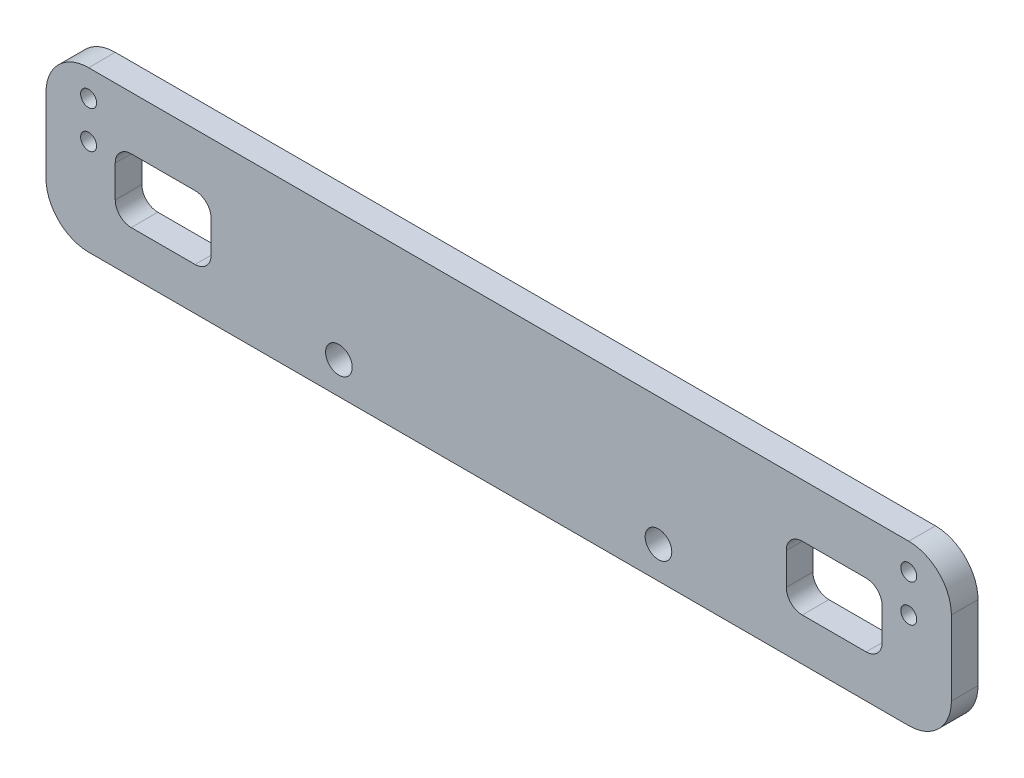
ISO-10303-21;
HEADER;
FILE_DESCRIPTION(('STEP AP214'),'2;1');
FILE_NAME('part.step','',(''),(''),'','','');
FILE_SCHEMA(('AUTOMOTIVE_DESIGN { 1 0 10303 214 1 1 1 1 }'));
ENDSEC;
DATA;
#1=APPLICATION_CONTEXT('core data for automotive mechanical design processes');
#2=APPLICATION_PROTOCOL_DEFINITION('international standard','automotive_design',2000,#1);
#3=PRODUCT_CONTEXT('',#1,'mechanical');
#4=PRODUCT('Part','Part','',(#3));
#5=PRODUCT_RELATED_PRODUCT_CATEGORY('part','',(#4));
#6=PRODUCT_DEFINITION_FORMATION('','',#4);
#7=PRODUCT_DEFINITION_CONTEXT('part definition',#1,'design');
#8=PRODUCT_DEFINITION('design','',#6,#7);
#9=PRODUCT_DEFINITION_SHAPE('','',#8);
#10=(LENGTH_UNIT() NAMED_UNIT(*) SI_UNIT(.MILLI.,.METRE.));
#11=(NAMED_UNIT(*) PLANE_ANGLE_UNIT() SI_UNIT($,.RADIAN.));
#12=(NAMED_UNIT(*) SI_UNIT($,.STERADIAN.) SOLID_ANGLE_UNIT());
#13=UNCERTAINTY_MEASURE_WITH_UNIT(LENGTH_MEASURE(1.E-05),#10,'distance_accuracy_value','');
#14=(GEOMETRIC_REPRESENTATION_CONTEXT(3) GLOBAL_UNCERTAINTY_ASSIGNED_CONTEXT((#13)) GLOBAL_UNIT_ASSIGNED_CONTEXT((#10,
#11,#12)) REPRESENTATION_CONTEXT('',''));
#15=CARTESIAN_POINT('',(0.,0.,0.));
#16=DIRECTION('',(0.,0.,1.));
#17=DIRECTION('',(1.,0.,0.));
#18=AXIS2_PLACEMENT_3D('',#15,#16,#17);
#19=CARTESIAN_POINT('',(0.,0.,5.));
#20=DIRECTION('',(0.,0.,-1.));
#21=DIRECTION('',(-1.,0.,0.));
#22=AXIS2_PLACEMENT_3D('',#19,#20,#21);
#23=PLANE('',#22);
#24=DIRECTION('',(-1.,0.,0.));
#25=VECTOR('',#24,1.);
#26=CARTESIAN_POINT('',(0.,-6.,5.));
#27=LINE('',#26,#25);
#28=CARTESIAN_POINT('',(69.,-6.,5.));
#29=VERTEX_POINT('',#28);
#30=CARTESIAN_POINT('',(57.,-6.,5.));
#31=VERTEX_POINT('',#30);
#32=EDGE_CURVE('E431',#29,#31,#27,.T.);
#33=ORIENTED_EDGE('',*,*,#32,.F.);
#34=CARTESIAN_POINT('',(69.,-9.,5.));
#35=DIRECTION('',(0.,0.,-1.));
#36=DIRECTION('',(-1.,0.,0.));
#37=AXIS2_PLACEMENT_3D('',#34,#35,#36);
#38=CIRCLE('',#37,3.);
#39=CARTESIAN_POINT('',(72.,-9.,5.));
#40=VERTEX_POINT('',#39);
#41=EDGE_CURVE('E227',#29,#40,#38,.T.);
#42=ORIENTED_EDGE('',*,*,#41,.T.);
#43=DIRECTION('',(0.,1.,0.));
#44=VECTOR('',#43,1.);
#45=CARTESIAN_POINT('',(72.,0.,5.));
#46=LINE('',#45,#44);
#47=CARTESIAN_POINT('',(72.,-15.,5.));
#48=VERTEX_POINT('',#47);
#49=EDGE_CURVE('E206',#48,#40,#46,.T.);
#50=ORIENTED_EDGE('',*,*,#49,.F.);
#51=CARTESIAN_POINT('',(69.,-15.,5.));
#52=DIRECTION('',(0.,0.,-1.));
#53=DIRECTION('',(-1.,0.,0.));
#54=AXIS2_PLACEMENT_3D('',#51,#52,#53);
#55=CIRCLE('',#54,3.);
#56=CARTESIAN_POINT('',(69.,-18.,5.));
#57=VERTEX_POINT('',#56);
#58=EDGE_CURVE('E373',#48,#57,#55,.T.);
#59=ORIENTED_EDGE('',*,*,#58,.T.);
#60=DIRECTION('',(1.,0.,0.));
#61=VECTOR('',#60,1.);
#62=CARTESIAN_POINT('',(0.,-18.,5.));
#63=LINE('',#62,#61);
#64=CARTESIAN_POINT('',(57.,-18.,5.));
#65=VERTEX_POINT('',#64);
#66=EDGE_CURVE('E379',#65,#57,#63,.T.);
#67=ORIENTED_EDGE('',*,*,#66,.F.);
#68=CARTESIAN_POINT('',(57.,-15.,5.));
#69=DIRECTION('',(0.,0.,-1.));
#70=DIRECTION('',(-1.,0.,0.));
#71=AXIS2_PLACEMENT_3D('',#68,#69,#70);
#72=CIRCLE('',#71,3.);
#73=CARTESIAN_POINT('',(54.,-15.,5.));
#74=VERTEX_POINT('',#73);
#75=EDGE_CURVE('E226',#65,#74,#72,.T.);
#76=ORIENTED_EDGE('',*,*,#75,.T.);
#77=DIRECTION('',(0.,-1.,0.));
#78=VECTOR('',#77,1.);
#79=CARTESIAN_POINT('',(54.,0.,5.));
#80=LINE('',#79,#78);
#81=CARTESIAN_POINT('',(54.,-9.,5.));
#82=VERTEX_POINT('',#81);
#83=EDGE_CURVE('E386',#82,#74,#80,.T.);
#84=ORIENTED_EDGE('',*,*,#83,.F.);
#85=CARTESIAN_POINT('',(57.,-9.,5.));
#86=DIRECTION('',(0.,0.,-1.));
#87=DIRECTION('',(-1.,0.,0.));
#88=AXIS2_PLACEMENT_3D('',#85,#86,#87);
#89=CIRCLE('',#88,3.);
#90=EDGE_CURVE('E235',#82,#31,#89,.T.);
#91=ORIENTED_EDGE('',*,*,#90,.T.);
#92=EDGE_LOOP('',(#33,#42,#50,#59,#67,#76,#84,#91));
#93=FACE_BOUND('',#92,.T.);
#94=CARTESIAN_POINT('',(77.0000000000001,-8.,5.));
#95=DIRECTION('',(0.,0.,1.));
#96=DIRECTION('',(-1.,0.,0.));
#97=AXIS2_PLACEMENT_3D('',#94,#95,#96);
#98=CIRCLE('',#97,1.5);
#99=CARTESIAN_POINT('',(75.5000000000001,-8.,5.));
#100=VERTEX_POINT('',#99);
#101=EDGE_CURVE('E463',#100,#100,#98,.T.);
#102=ORIENTED_EDGE('',*,*,#101,.F.);
#103=EDGE_LOOP('',(#102));
#104=FACE_BOUND('',#103,.T.);
#105=CARTESIAN_POINT('',(77.0000000000001,-1.,5.));
#106=DIRECTION('',(0.,0.,1.));
#107=DIRECTION('',(-1.,0.,0.));
#108=AXIS2_PLACEMENT_3D('',#105,#106,#107);
#109=CIRCLE('',#108,1.5);
#110=CARTESIAN_POINT('',(75.5000000000001,-1.,5.));
#111=VERTEX_POINT('',#110);
#112=EDGE_CURVE('E469',#111,#111,#109,.T.);
#113=ORIENTED_EDGE('',*,*,#112,.F.);
#114=EDGE_LOOP('',(#113));
#115=FACE_BOUND('',#114,.T.);
#116=CARTESIAN_POINT('',(-77.,-1.,5.));
#117=DIRECTION('',(0.,0.,1.));
#118=DIRECTION('',(1.,0.,0.));
#119=AXIS2_PLACEMENT_3D('',#116,#117,#118);
#120=CIRCLE('',#119,1.5);
#121=CARTESIAN_POINT('',(-75.5,-1.,5.));
#122=VERTEX_POINT('',#121);
#123=EDGE_CURVE('E475',#122,#122,#120,.T.);
#124=ORIENTED_EDGE('',*,*,#123,.F.);
#125=EDGE_LOOP('',(#124));
#126=FACE_BOUND('',#125,.T.);
#127=CARTESIAN_POINT('',(-77.,-8.,5.));
#128=DIRECTION('',(0.,0.,1.));
#129=DIRECTION('',(1.,0.,0.));
#130=AXIS2_PLACEMENT_3D('',#127,#128,#129);
#131=CIRCLE('',#130,1.5);
#132=CARTESIAN_POINT('',(-75.5,-8.,5.));
#133=VERTEX_POINT('',#132);
#134=EDGE_CURVE('E316',#133,#133,#131,.T.);
#135=ORIENTED_EDGE('',*,*,#134,.F.);
#136=EDGE_LOOP('',(#135));
#137=FACE_BOUND('',#136,.T.);
#138=DIRECTION('',(0.,-1.,0.));
#139=VECTOR('',#138,1.);
#140=CARTESIAN_POINT('',(-85.,-30.,5.));
#141=LINE('',#140,#139);
#142=CARTESIAN_POINT('',(-85.,-4.,5.));
#143=VERTEX_POINT('',#142);
#144=CARTESIAN_POINT('',(-85.,-18.,5.));
#145=VERTEX_POINT('',#144);
#146=EDGE_CURVE('E309',#143,#145,#141,.T.);
#147=ORIENTED_EDGE('',*,*,#146,.T.);
#148=CARTESIAN_POINT('',(-77.,-18.,5.));
#149=DIRECTION('',(0.,0.,-1.));
#150=DIRECTION('',(-1.,0.,0.));
#151=AXIS2_PLACEMENT_3D('',#148,#149,#150);
#152=CIRCLE('',#151,8.);
#153=CARTESIAN_POINT('',(-77.,-26.,5.));
#154=VERTEX_POINT('',#153);
#155=EDGE_CURVE('E267',#145,#154,#152,.F.);
#156=ORIENTED_EDGE('',*,*,#155,.T.);
#157=DIRECTION('',(-1.,0.,0.));
#158=VECTOR('',#157,1.);
#159=CARTESIAN_POINT('',(-85.,-26.,5.));
#160=LINE('',#159,#158);
#161=CARTESIAN_POINT('',(77.,-26.,5.));
#162=VERTEX_POINT('',#161);
#163=EDGE_CURVE('E429',#162,#154,#160,.T.);
#164=ORIENTED_EDGE('',*,*,#163,.F.);
#165=CARTESIAN_POINT('',(77.,-18.,5.));
#166=DIRECTION('',(0.,0.,-1.));
#167=DIRECTION('',(-1.,0.,0.));
#168=AXIS2_PLACEMENT_3D('',#165,#166,#167);
#169=CIRCLE('',#168,8.);
#170=CARTESIAN_POINT('',(85.,-18.,5.));
#171=VERTEX_POINT('',#170);
#172=EDGE_CURVE('E265',#162,#171,#169,.F.);
#173=ORIENTED_EDGE('',*,*,#172,.T.);
#174=DIRECTION('',(0.,1.,0.));
#175=VECTOR('',#174,1.);
#176=CARTESIAN_POINT('',(85.,-30.,5.));
#177=LINE('',#176,#175);
#178=CARTESIAN_POINT('',(85.,-3.99999999999998,5.));
#179=VERTEX_POINT('',#178);
#180=EDGE_CURVE('E312',#171,#179,#177,.T.);
#181=ORIENTED_EDGE('',*,*,#180,.T.);
#182=CARTESIAN_POINT('',(77.,-3.99999999999998,5.));
#183=DIRECTION('',(0.,0.,-1.));
#184=DIRECTION('',(-1.,0.,0.));
#185=AXIS2_PLACEMENT_3D('',#182,#183,#184);
#186=CIRCLE('',#185,8.);
#187=CARTESIAN_POINT('',(77.,4.00000000000002,5.));
#188=VERTEX_POINT('',#187);
#189=EDGE_CURVE('E263',#179,#188,#186,.F.);
#190=ORIENTED_EDGE('',*,*,#189,.T.);
#191=DIRECTION('',(1.,0.,0.));
#192=VECTOR('',#191,1.);
#193=CARTESIAN_POINT('',(85.,4.00000000000002,5.));
#194=LINE('',#193,#192);
#195=CARTESIAN_POINT('',(-77.,4.,5.));
#196=VERTEX_POINT('',#195);
#197=EDGE_CURVE('E290',#196,#188,#194,.T.);
#198=ORIENTED_EDGE('',*,*,#197,.F.);
#199=CARTESIAN_POINT('',(-77.,-4.,5.));
#200=DIRECTION('',(0.,0.,-1.));
#201=DIRECTION('',(-1.,0.,0.));
#202=AXIS2_PLACEMENT_3D('',#199,#200,#201);
#203=CIRCLE('',#202,8.);
#204=EDGE_CURVE('E261',#196,#143,#203,.F.);
#205=ORIENTED_EDGE('',*,*,#204,.T.);
#206=EDGE_LOOP('',(#147,#156,#164,#173,#181,#190,#198,#205));
#207=FACE_BOUND('',#206,.T.);
#208=CARTESIAN_POINT('',(-30.,-20.,5.));
#209=DIRECTION('',(0.,0.,1.));
#210=DIRECTION('',(1.,0.,0.));
#211=AXIS2_PLACEMENT_3D('',#208,#209,#210);
#212=CIRCLE('',#211,2.5);
#213=CARTESIAN_POINT('',(-27.5,-20.,5.));
#214=VERTEX_POINT('',#213);
#215=EDGE_CURVE('E454',#214,#214,#212,.T.);
#216=ORIENTED_EDGE('',*,*,#215,.F.);
#217=EDGE_LOOP('',(#216));
#218=FACE_BOUND('',#217,.T.);
#219=CARTESIAN_POINT('',(30.,-20.,5.));
#220=DIRECTION('',(0.,0.,1.));
#221=DIRECTION('',(1.,0.,0.));
#222=AXIS2_PLACEMENT_3D('',#219,#220,#221);
#223=CIRCLE('',#222,2.5);
#224=CARTESIAN_POINT('',(32.5,-20.,5.));
#225=VERTEX_POINT('',#224);
#226=EDGE_CURVE('E450',#225,#225,#223,.T.);
#227=ORIENTED_EDGE('',*,*,#226,.F.);
#228=EDGE_LOOP('',(#227));
#229=FACE_BOUND('',#228,.T.);
#230=DIRECTION('',(-1.,0.,0.));
#231=VECTOR('',#230,1.);
#232=CARTESIAN_POINT('',(0.,-18.,5.));
#233=LINE('',#232,#231);
#234=CARTESIAN_POINT('',(-57.,-18.,5.));
#235=VERTEX_POINT('',#234);
#236=CARTESIAN_POINT('',(-69.,-18.,5.));
#237=VERTEX_POINT('',#236);
#238=EDGE_CURVE('E441',#235,#237,#233,.T.);
#239=ORIENTED_EDGE('',*,*,#238,.T.);
#240=CARTESIAN_POINT('',(-69.,-15.,5.));
#241=DIRECTION('',(0.,0.,-1.));
#242=DIRECTION('',(-1.,0.,0.));
#243=AXIS2_PLACEMENT_3D('',#240,#241,#242);
#244=CIRCLE('',#243,3.);
#245=CARTESIAN_POINT('',(-72.,-15.,5.));
#246=VERTEX_POINT('',#245);
#247=EDGE_CURVE('E247',#237,#246,#244,.T.);
#248=ORIENTED_EDGE('',*,*,#247,.T.);
#249=DIRECTION('',(0.,1.,0.));
#250=VECTOR('',#249,1.);
#251=CARTESIAN_POINT('',(-72.,0.,5.));
#252=LINE('',#251,#250);
#253=CARTESIAN_POINT('',(-72.,-9.,5.));
#254=VERTEX_POINT('',#253);
#255=EDGE_CURVE('E385',#246,#254,#252,.T.);
#256=ORIENTED_EDGE('',*,*,#255,.T.);
#257=CARTESIAN_POINT('',(-69.,-9.,5.));
#258=DIRECTION('',(0.,0.,-1.));
#259=DIRECTION('',(-1.,0.,0.));
#260=AXIS2_PLACEMENT_3D('',#257,#258,#259);
#261=CIRCLE('',#260,3.);
#262=CARTESIAN_POINT('',(-69.,-6.,5.));
#263=VERTEX_POINT('',#262);
#264=EDGE_CURVE('E251',#254,#263,#261,.T.);
#265=ORIENTED_EDGE('',*,*,#264,.T.);
#266=DIRECTION('',(1.,0.,0.));
#267=VECTOR('',#266,1.);
#268=CARTESIAN_POINT('',(0.,-6.,5.));
#269=LINE('',#268,#267);
#270=CARTESIAN_POINT('',(-57.,-6.,5.));
#271=VERTEX_POINT('',#270);
#272=EDGE_CURVE('E300',#263,#271,#269,.T.);
#273=ORIENTED_EDGE('',*,*,#272,.T.);
#274=CARTESIAN_POINT('',(-57.,-9.,5.));
#275=DIRECTION('',(0.,0.,-1.));
#276=DIRECTION('',(-1.,0.,0.));
#277=AXIS2_PLACEMENT_3D('',#274,#275,#276);
#278=CIRCLE('',#277,3.);
#279=CARTESIAN_POINT('',(-54.,-9.,5.));
#280=VERTEX_POINT('',#279);
#281=EDGE_CURVE('E243',#271,#280,#278,.T.);
#282=ORIENTED_EDGE('',*,*,#281,.T.);
#283=DIRECTION('',(0.,-1.,0.));
#284=VECTOR('',#283,1.);
#285=CARTESIAN_POINT('',(-54.,0.,5.));
#286=LINE('',#285,#284);
#287=CARTESIAN_POINT('',(-54.,-15.,5.));
#288=VERTEX_POINT('',#287);
#289=EDGE_CURVE('E444',#280,#288,#286,.T.);
#290=ORIENTED_EDGE('',*,*,#289,.T.);
#291=CARTESIAN_POINT('',(-57.,-15.,5.));
#292=DIRECTION('',(0.,0.,-1.));
#293=DIRECTION('',(-1.,0.,0.));
#294=AXIS2_PLACEMENT_3D('',#291,#292,#293);
#295=CIRCLE('',#294,3.);
#296=EDGE_CURVE('E239',#288,#235,#295,.T.);
#297=ORIENTED_EDGE('',*,*,#296,.T.);
#298=EDGE_LOOP('',(#239,#248,#256,#265,#273,#282,#290,#297));
#299=FACE_BOUND('',#298,.T.);
#300=ADVANCED_FACE('F36',(#93,#104,#115,#126,#137,#207,#218,#229,#299),#23,.F.);
#301=CARTESIAN_POINT('',(0.,0.,0.));
#302=DIRECTION('',(0.,0.,-1.));
#303=DIRECTION('',(-1.,0.,0.));
#304=AXIS2_PLACEMENT_3D('',#301,#302,#303);
#305=PLANE('',#304);
#306=DIRECTION('',(-1.,0.,0.));
#307=VECTOR('',#306,1.);
#308=CARTESIAN_POINT('',(-85.,-26.,0.));
#309=LINE('',#308,#307);
#310=CARTESIAN_POINT('',(77.,-26.,0.));
#311=VERTEX_POINT('',#310);
#312=CARTESIAN_POINT('',(-77.,-26.,0.));
#313=VERTEX_POINT('',#312);
#314=EDGE_CURVE('E423',#311,#313,#309,.T.);
#315=ORIENTED_EDGE('',*,*,#314,.T.);
#316=CARTESIAN_POINT('',(-77.,-18.,0.));
#317=DIRECTION('',(0.,0.,-1.));
#318=DIRECTION('',(-1.,0.,0.));
#319=AXIS2_PLACEMENT_3D('',#316,#317,#318);
#320=CIRCLE('',#319,8.);
#321=CARTESIAN_POINT('',(-85.,-18.,0.));
#322=VERTEX_POINT('',#321);
#323=EDGE_CURVE('E279',#313,#322,#320,.T.);
#324=ORIENTED_EDGE('',*,*,#323,.T.);
#325=DIRECTION('',(0.,-1.,0.));
#326=VECTOR('',#325,1.);
#327=CARTESIAN_POINT('',(-85.,-30.,0.));
#328=LINE('',#327,#326);
#329=CARTESIAN_POINT('',(-85.,-4.,0.));
#330=VERTEX_POINT('',#329);
#331=EDGE_CURVE('E307',#330,#322,#328,.T.);
#332=ORIENTED_EDGE('',*,*,#331,.F.);
#333=CARTESIAN_POINT('',(-77.,-4.,0.));
#334=DIRECTION('',(0.,0.,-1.));
#335=DIRECTION('',(-1.,0.,0.));
#336=AXIS2_PLACEMENT_3D('',#333,#334,#335);
#337=CIRCLE('',#336,8.);
#338=CARTESIAN_POINT('',(-77.,4.,0.));
#339=VERTEX_POINT('',#338);
#340=EDGE_CURVE('E274',#330,#339,#337,.T.);
#341=ORIENTED_EDGE('',*,*,#340,.T.);
#342=DIRECTION('',(-1.,0.,0.));
#343=VECTOR('',#342,1.);
#344=CARTESIAN_POINT('',(0.,4.00000000000001,0.));
#345=LINE('',#344,#343);
#346=CARTESIAN_POINT('',(77.,4.00000000000002,0.));
#347=VERTEX_POINT('',#346);
#348=EDGE_CURVE('E292',#347,#339,#345,.T.);
#349=ORIENTED_EDGE('',*,*,#348,.F.);
#350=CARTESIAN_POINT('',(77.,-3.99999999999998,0.));
#351=DIRECTION('',(0.,0.,-1.));
#352=DIRECTION('',(-1.,0.,0.));
#353=AXIS2_PLACEMENT_3D('',#350,#351,#352);
#354=CIRCLE('',#353,8.);
#355=CARTESIAN_POINT('',(85.,-3.99999999999998,0.));
#356=VERTEX_POINT('',#355);
#357=EDGE_CURVE('E51',#347,#356,#354,.T.);
#358=ORIENTED_EDGE('',*,*,#357,.T.);
#359=DIRECTION('',(0.,1.,0.));
#360=VECTOR('',#359,1.);
#361=CARTESIAN_POINT('',(85.,-30.,0.));
#362=LINE('',#361,#360);
#363=CARTESIAN_POINT('',(85.,-18.,0.));
#364=VERTEX_POINT('',#363);
#365=EDGE_CURVE('E313',#364,#356,#362,.T.);
#366=ORIENTED_EDGE('',*,*,#365,.F.);
#367=CARTESIAN_POINT('',(77.,-18.,0.));
#368=DIRECTION('',(0.,0.,-1.));
#369=DIRECTION('',(-1.,0.,0.));
#370=AXIS2_PLACEMENT_3D('',#367,#368,#369);
#371=CIRCLE('',#370,8.);
#372=EDGE_CURVE('E277',#364,#311,#371,.T.);
#373=ORIENTED_EDGE('',*,*,#372,.T.);
#374=EDGE_LOOP('',(#315,#324,#332,#341,#349,#358,#366,#373));
#375=FACE_BOUND('',#374,.T.);
#376=DIRECTION('',(0.,-1.,0.));
#377=VECTOR('',#376,1.);
#378=CARTESIAN_POINT('',(72.,0.,0.));
#379=LINE('',#378,#377);
#380=CARTESIAN_POINT('',(72.,-9.,0.));
#381=VERTEX_POINT('',#380);
#382=CARTESIAN_POINT('',(72.,-15.,0.));
#383=VERTEX_POINT('',#382);
#384=EDGE_CURVE('E203',#381,#383,#379,.T.);
#385=ORIENTED_EDGE('',*,*,#384,.F.);
#386=CARTESIAN_POINT('',(69.,-9.,0.));
#387=DIRECTION('',(0.,0.,-1.));
#388=DIRECTION('',(-1.,0.,0.));
#389=AXIS2_PLACEMENT_3D('',#386,#387,#388);
#390=CIRCLE('',#389,3.);
#391=CARTESIAN_POINT('',(69.,-6.,0.));
#392=VERTEX_POINT('',#391);
#393=EDGE_CURVE('E215',#381,#392,#390,.F.);
#394=ORIENTED_EDGE('',*,*,#393,.T.);
#395=DIRECTION('',(1.,0.,0.));
#396=VECTOR('',#395,1.);
#397=CARTESIAN_POINT('',(0.,-6.,0.));
#398=LINE('',#397,#396);
#399=CARTESIAN_POINT('',(57.,-6.,0.));
#400=VERTEX_POINT('',#399);
#401=EDGE_CURVE('E332',#400,#392,#398,.T.);
#402=ORIENTED_EDGE('',*,*,#401,.F.);
#403=CARTESIAN_POINT('',(57.,-9.,0.));
#404=DIRECTION('',(0.,0.,-1.));
#405=DIRECTION('',(-1.,0.,0.));
#406=AXIS2_PLACEMENT_3D('',#403,#404,#405);
#407=CIRCLE('',#406,3.);
#408=CARTESIAN_POINT('',(54.,-9.,0.));
#409=VERTEX_POINT('',#408);
#410=EDGE_CURVE('E237',#400,#409,#407,.F.);
#411=ORIENTED_EDGE('',*,*,#410,.T.);
#412=DIRECTION('',(0.,1.,0.));
#413=VECTOR('',#412,1.);
#414=CARTESIAN_POINT('',(54.,0.,0.));
#415=LINE('',#414,#413);
#416=CARTESIAN_POINT('',(54.,-15.,0.));
#417=VERTEX_POINT('',#416);
#418=EDGE_CURVE('E334',#417,#409,#415,.T.);
#419=ORIENTED_EDGE('',*,*,#418,.F.);
#420=CARTESIAN_POINT('',(57.,-15.,0.));
#421=DIRECTION('',(0.,0.,-1.));
#422=DIRECTION('',(-1.,0.,0.));
#423=AXIS2_PLACEMENT_3D('',#420,#421,#422);
#424=CIRCLE('',#423,3.);
#425=CARTESIAN_POINT('',(57.,-18.,0.));
#426=VERTEX_POINT('',#425);
#427=EDGE_CURVE('E229',#417,#426,#424,.F.);
#428=ORIENTED_EDGE('',*,*,#427,.T.);
#429=DIRECTION('',(-1.,0.,0.));
#430=VECTOR('',#429,1.);
#431=CARTESIAN_POINT('',(0.,-18.,0.));
#432=LINE('',#431,#430);
#433=CARTESIAN_POINT('',(69.,-18.,0.));
#434=VERTEX_POINT('',#433);
#435=EDGE_CURVE('E220',#434,#426,#432,.T.);
#436=ORIENTED_EDGE('',*,*,#435,.F.);
#437=CARTESIAN_POINT('',(69.,-15.,0.));
#438=DIRECTION('',(0.,0.,-1.));
#439=DIRECTION('',(-1.,0.,0.));
#440=AXIS2_PLACEMENT_3D('',#437,#438,#439);
#441=CIRCLE('',#440,3.);
#442=EDGE_CURVE('E219',#434,#383,#441,.F.);
#443=ORIENTED_EDGE('',*,*,#442,.T.);
#444=EDGE_LOOP('',(#385,#394,#402,#411,#419,#428,#436,#443));
#445=FACE_BOUND('',#444,.T.);
#446=CARTESIAN_POINT('',(30.,-20.,0.));
#447=DIRECTION('',(0.,0.,1.));
#448=DIRECTION('',(1.,0.,0.));
#449=AXIS2_PLACEMENT_3D('',#446,#447,#448);
#450=CIRCLE('',#449,2.5);
#451=CARTESIAN_POINT('',(32.5,-20.,0.));
#452=VERTEX_POINT('',#451);
#453=EDGE_CURVE('E451',#452,#452,#450,.T.);
#454=ORIENTED_EDGE('',*,*,#453,.T.);
#455=EDGE_LOOP('',(#454));
#456=FACE_BOUND('',#455,.T.);
#457=CARTESIAN_POINT('',(-30.,-20.,0.));
#458=DIRECTION('',(0.,0.,1.));
#459=DIRECTION('',(1.,0.,0.));
#460=AXIS2_PLACEMENT_3D('',#457,#458,#459);
#461=CIRCLE('',#460,2.5);
#462=CARTESIAN_POINT('',(-27.5,-20.,0.));
#463=VERTEX_POINT('',#462);
#464=EDGE_CURVE('E457',#463,#463,#461,.T.);
#465=ORIENTED_EDGE('',*,*,#464,.T.);
#466=EDGE_LOOP('',(#465));
#467=FACE_BOUND('',#466,.T.);
#468=CARTESIAN_POINT('',(77.0000000000001,-1.,0.));
#469=DIRECTION('',(0.,0.,1.));
#470=DIRECTION('',(-1.,0.,0.));
#471=AXIS2_PLACEMENT_3D('',#468,#469,#470);
#472=CIRCLE('',#471,1.5);
#473=CARTESIAN_POINT('',(75.5000000000001,-1.,0.));
#474=VERTEX_POINT('',#473);
#475=EDGE_CURVE('E466',#474,#474,#472,.T.);
#476=ORIENTED_EDGE('',*,*,#475,.T.);
#477=EDGE_LOOP('',(#476));
#478=FACE_BOUND('',#477,.T.);
#479=CARTESIAN_POINT('',(-77.,-8.,0.));
#480=DIRECTION('',(0.,0.,1.));
#481=DIRECTION('',(1.,0.,0.));
#482=AXIS2_PLACEMENT_3D('',#479,#480,#481);
#483=CIRCLE('',#482,1.5);
#484=CARTESIAN_POINT('',(-75.5,-8.,0.));
#485=VERTEX_POINT('',#484);
#486=EDGE_CURVE('E478',#485,#485,#483,.T.);
#487=ORIENTED_EDGE('',*,*,#486,.T.);
#488=EDGE_LOOP('',(#487));
#489=FACE_BOUND('',#488,.T.);
#490=CARTESIAN_POINT('',(-77.,-1.,0.));
#491=DIRECTION('',(0.,0.,1.));
#492=DIRECTION('',(1.,0.,0.));
#493=AXIS2_PLACEMENT_3D('',#490,#491,#492);
#494=CIRCLE('',#493,1.5);
#495=CARTESIAN_POINT('',(-75.5,-1.,0.));
#496=VERTEX_POINT('',#495);
#497=EDGE_CURVE('E472',#496,#496,#494,.T.);
#498=ORIENTED_EDGE('',*,*,#497,.T.);
#499=EDGE_LOOP('',(#498));
#500=FACE_BOUND('',#499,.T.);
#501=CARTESIAN_POINT('',(77.0000000000001,-8.,0.));
#502=DIRECTION('',(0.,0.,1.));
#503=DIRECTION('',(-1.,0.,0.));
#504=AXIS2_PLACEMENT_3D('',#501,#502,#503);
#505=CIRCLE('',#504,1.5);
#506=CARTESIAN_POINT('',(75.5000000000001,-8.,0.));
#507=VERTEX_POINT('',#506);
#508=EDGE_CURVE('E460',#507,#507,#505,.T.);
#509=ORIENTED_EDGE('',*,*,#508,.T.);
#510=EDGE_LOOP('',(#509));
#511=FACE_BOUND('',#510,.T.);
#512=DIRECTION('',(0.,1.,0.));
#513=VECTOR('',#512,1.);
#514=CARTESIAN_POINT('',(-54.,0.,0.));
#515=LINE('',#514,#513);
#516=CARTESIAN_POINT('',(-54.,-15.,0.));
#517=VERTEX_POINT('',#516);
#518=CARTESIAN_POINT('',(-54.,-9.,0.));
#519=VERTEX_POINT('',#518);
#520=EDGE_CURVE('E323',#517,#519,#515,.T.);
#521=ORIENTED_EDGE('',*,*,#520,.T.);
#522=CARTESIAN_POINT('',(-57.,-9.,0.));
#523=DIRECTION('',(0.,0.,-1.));
#524=DIRECTION('',(-1.,0.,0.));
#525=AXIS2_PLACEMENT_3D('',#522,#523,#524);
#526=CIRCLE('',#525,3.);
#527=CARTESIAN_POINT('',(-57.,-6.,0.));
#528=VERTEX_POINT('',#527);
#529=EDGE_CURVE('E245',#519,#528,#526,.F.);
#530=ORIENTED_EDGE('',*,*,#529,.T.);
#531=DIRECTION('',(-1.,0.,0.));
#532=VECTOR('',#531,1.);
#533=CARTESIAN_POINT('',(0.,-6.,0.));
#534=LINE('',#533,#532);
#535=CARTESIAN_POINT('',(-69.,-6.,0.));
#536=VERTEX_POINT('',#535);
#537=EDGE_CURVE('E326',#528,#536,#534,.T.);
#538=ORIENTED_EDGE('',*,*,#537,.T.);
#539=CARTESIAN_POINT('',(-69.,-9.,0.));
#540=DIRECTION('',(0.,0.,-1.));
#541=DIRECTION('',(-1.,0.,0.));
#542=AXIS2_PLACEMENT_3D('',#539,#540,#541);
#543=CIRCLE('',#542,3.);
#544=CARTESIAN_POINT('',(-72.,-9.,0.));
#545=VERTEX_POINT('',#544);
#546=EDGE_CURVE('E253',#536,#545,#543,.F.);
#547=ORIENTED_EDGE('',*,*,#546,.T.);
#548=DIRECTION('',(0.,-1.,0.));
#549=VECTOR('',#548,1.);
#550=CARTESIAN_POINT('',(-72.,0.,0.));
#551=LINE('',#550,#549);
#552=CARTESIAN_POINT('',(-72.,-15.,0.));
#553=VERTEX_POINT('',#552);
#554=EDGE_CURVE('E329',#545,#553,#551,.T.);
#555=ORIENTED_EDGE('',*,*,#554,.T.);
#556=CARTESIAN_POINT('',(-69.,-15.,0.));
#557=DIRECTION('',(0.,0.,-1.));
#558=DIRECTION('',(-1.,0.,0.));
#559=AXIS2_PLACEMENT_3D('',#556,#557,#558);
#560=CIRCLE('',#559,3.);
#561=CARTESIAN_POINT('',(-69.,-18.,0.));
#562=VERTEX_POINT('',#561);
#563=EDGE_CURVE('E249',#553,#562,#560,.F.);
#564=ORIENTED_EDGE('',*,*,#563,.T.);
#565=DIRECTION('',(1.,0.,0.));
#566=VECTOR('',#565,1.);
#567=CARTESIAN_POINT('',(0.,-18.,0.));
#568=LINE('',#567,#566);
#569=CARTESIAN_POINT('',(-57.,-18.,0.));
#570=VERTEX_POINT('',#569);
#571=EDGE_CURVE('E320',#562,#570,#568,.T.);
#572=ORIENTED_EDGE('',*,*,#571,.T.);
#573=CARTESIAN_POINT('',(-57.,-15.,0.));
#574=DIRECTION('',(0.,0.,-1.));
#575=DIRECTION('',(-1.,0.,0.));
#576=AXIS2_PLACEMENT_3D('',#573,#574,#575);
#577=CIRCLE('',#576,3.);
#578=EDGE_CURVE('E241',#570,#517,#577,.F.);
#579=ORIENTED_EDGE('',*,*,#578,.T.);
#580=EDGE_LOOP('',(#521,#530,#538,#547,#555,#564,#572,#579));
#581=FACE_BOUND('',#580,.T.);
#582=ADVANCED_FACE('F212',(#375,#445,#456,#467,#478,#489,#500,#511,#581),#305,.T.);
#583=CARTESIAN_POINT('',(85.,-30.,5.));
#584=DIRECTION('',(-1.,0.,0.));
#585=DIRECTION('',(0.,0.,1.));
#586=AXIS2_PLACEMENT_3D('',#583,#584,#585);
#587=PLANE('',#586);
#588=ORIENTED_EDGE('',*,*,#180,.F.);
#589=DIRECTION('',(0.,0.,1.));
#590=VECTOR('',#589,1.);
#591=CARTESIAN_POINT('',(85.,-18.,5.));
#592=LINE('',#591,#590);
#593=EDGE_CURVE('E58',#171,#364,#592,.F.);
#594=ORIENTED_EDGE('',*,*,#593,.T.);
#595=ORIENTED_EDGE('',*,*,#365,.T.);
#596=DIRECTION('',(0.,0.,1.));
#597=VECTOR('',#596,1.);
#598=CARTESIAN_POINT('',(85.,-3.99999999999998,5.));
#599=LINE('',#598,#597);
#600=EDGE_CURVE('E281',#356,#179,#599,.T.);
#601=ORIENTED_EDGE('',*,*,#600,.T.);
#602=EDGE_LOOP('',(#588,#594,#595,#601));
#603=FACE_BOUND('',#602,.T.);
#604=ADVANCED_FACE('F407',(#603),#587,.F.);
#605=CARTESIAN_POINT('',(-85.,-30.,5.));
#606=DIRECTION('',(1.,0.,0.));
#607=DIRECTION('',(0.,0.,-1.));
#608=AXIS2_PLACEMENT_3D('',#605,#606,#607);
#609=PLANE('',#608);
#610=ORIENTED_EDGE('',*,*,#331,.T.);
#611=DIRECTION('',(0.,0.,1.));
#612=VECTOR('',#611,1.);
#613=CARTESIAN_POINT('',(-85.,-18.,5.));
#614=LINE('',#613,#612);
#615=EDGE_CURVE('E258',#322,#145,#614,.T.);
#616=ORIENTED_EDGE('',*,*,#615,.T.);
#617=ORIENTED_EDGE('',*,*,#146,.F.);
#618=DIRECTION('',(0.,0.,-1.));
#619=VECTOR('',#618,1.);
#620=CARTESIAN_POINT('',(-85.,-4.,5.));
#621=LINE('',#620,#619);
#622=EDGE_CURVE('E255',#143,#330,#621,.T.);
#623=ORIENTED_EDGE('',*,*,#622,.T.);
#624=EDGE_LOOP('',(#610,#616,#617,#623));
#625=FACE_BOUND('',#624,.T.);
#626=ADVANCED_FACE('F306',(#625),#609,.F.);
#627=CARTESIAN_POINT('',(-77.,-8.,5.));
#628=DIRECTION('',(0.,0.,-1.));
#629=DIRECTION('',(-1.,0.,0.));
#630=AXIS2_PLACEMENT_3D('',#627,#628,#629);
#631=CYLINDRICAL_SURFACE('',#630,1.5);
#632=ORIENTED_EDGE('',*,*,#134,.T.);
#633=EDGE_LOOP('',(#632));
#634=FACE_BOUND('',#633,.T.);
#635=ORIENTED_EDGE('',*,*,#486,.F.);
#636=EDGE_LOOP('',(#635));
#637=FACE_BOUND('',#636,.T.);
#638=ADVANCED_FACE('F410',(#634,#637),#631,.F.);
#639=CARTESIAN_POINT('',(-77.,-1.,5.));
#640=DIRECTION('',(0.,0.,-1.));
#641=DIRECTION('',(-1.,0.,0.));
#642=AXIS2_PLACEMENT_3D('',#639,#640,#641);
#643=CYLINDRICAL_SURFACE('',#642,1.5);
#644=ORIENTED_EDGE('',*,*,#123,.T.);
#645=EDGE_LOOP('',(#644));
#646=FACE_BOUND('',#645,.T.);
#647=ORIENTED_EDGE('',*,*,#497,.F.);
#648=EDGE_LOOP('',(#647));
#649=FACE_BOUND('',#648,.T.);
#650=ADVANCED_FACE('F732',(#646,#649),#643,.F.);
#651=CARTESIAN_POINT('',(77.0000000000001,-1.,5.));
#652=DIRECTION('',(0.,0.,-1.));
#653=DIRECTION('',(-1.,0.,0.));
#654=AXIS2_PLACEMENT_3D('',#651,#652,#653);
#655=CYLINDRICAL_SURFACE('',#654,1.5);
#656=ORIENTED_EDGE('',*,*,#112,.T.);
#657=EDGE_LOOP('',(#656));
#658=FACE_BOUND('',#657,.T.);
#659=ORIENTED_EDGE('',*,*,#475,.F.);
#660=EDGE_LOOP('',(#659));
#661=FACE_BOUND('',#660,.T.);
#662=ADVANCED_FACE('F722',(#658,#661),#655,.F.);
#663=CARTESIAN_POINT('',(77.0000000000001,-8.,5.));
#664=DIRECTION('',(0.,0.,-1.));
#665=DIRECTION('',(-1.,0.,0.));
#666=AXIS2_PLACEMENT_3D('',#663,#664,#665);
#667=CYLINDRICAL_SURFACE('',#666,1.5);
#668=ORIENTED_EDGE('',*,*,#101,.T.);
#669=EDGE_LOOP('',(#668));
#670=FACE_BOUND('',#669,.T.);
#671=ORIENTED_EDGE('',*,*,#508,.F.);
#672=EDGE_LOOP('',(#671));
#673=FACE_BOUND('',#672,.T.);
#674=ADVANCED_FACE('F712',(#670,#673),#667,.F.);
#675=CARTESIAN_POINT('',(-30.,-20.,0.));
#676=DIRECTION('',(0.,0.,1.));
#677=DIRECTION('',(1.,0.,0.));
#678=AXIS2_PLACEMENT_3D('',#675,#676,#677);
#679=CYLINDRICAL_SURFACE('',#678,2.5);
#680=ORIENTED_EDGE('',*,*,#464,.F.);
#681=EDGE_LOOP('',(#680));
#682=FACE_BOUND('',#681,.T.);
#683=ORIENTED_EDGE('',*,*,#215,.T.);
#684=EDGE_LOOP('',(#683));
#685=FACE_BOUND('',#684,.T.);
#686=ADVANCED_FACE('F702',(#682,#685),#679,.F.);
#687=CARTESIAN_POINT('',(30.,-20.,0.));
#688=DIRECTION('',(0.,0.,1.));
#689=DIRECTION('',(1.,0.,0.));
#690=AXIS2_PLACEMENT_3D('',#687,#688,#689);
#691=CYLINDRICAL_SURFACE('',#690,2.5);
#692=ORIENTED_EDGE('',*,*,#453,.F.);
#693=EDGE_LOOP('',(#692));
#694=FACE_BOUND('',#693,.T.);
#695=ORIENTED_EDGE('',*,*,#226,.T.);
#696=EDGE_LOOP('',(#695));
#697=FACE_BOUND('',#696,.T.);
#698=ADVANCED_FACE('F537',(#694,#697),#691,.F.);
#699=CARTESIAN_POINT('',(85.,4.00000000000002,-5.));
#700=DIRECTION('',(0.,-1.,0.));
#701=DIRECTION('',(1.,0.,0.));
#702=AXIS2_PLACEMENT_3D('',#699,#700,#701);
#703=PLANE('',#702);
#704=ORIENTED_EDGE('',*,*,#197,.T.);
#705=DIRECTION('',(0.,0.,1.));
#706=VECTOR('',#705,1.);
#707=CARTESIAN_POINT('',(77.,4.00000000000002,-5.));
#708=LINE('',#707,#706);
#709=EDGE_CURVE('E11',#188,#347,#708,.F.);
#710=ORIENTED_EDGE('',*,*,#709,.T.);
#711=ORIENTED_EDGE('',*,*,#348,.T.);
#712=DIRECTION('',(0.,0.,-1.));
#713=VECTOR('',#712,1.);
#714=CARTESIAN_POINT('',(-77.,4.,-5.));
#715=LINE('',#714,#713);
#716=EDGE_CURVE('E44',#339,#196,#715,.F.);
#717=ORIENTED_EDGE('',*,*,#716,.T.);
#718=EDGE_LOOP('',(#704,#710,#711,#717));
#719=FACE_BOUND('',#718,.T.);
#720=ADVANCED_FACE('F289',(#719),#703,.F.);
#721=CARTESIAN_POINT('',(-72.,0.,-5.));
#722=DIRECTION('',(1.,0.,0.));
#723=DIRECTION('',(0.,0.,-1.));
#724=AXIS2_PLACEMENT_3D('',#721,#722,#723);
#725=PLANE('',#724);
#726=ORIENTED_EDGE('',*,*,#255,.F.);
#727=DIRECTION('',(0.,0.,1.));
#728=VECTOR('',#727,1.);
#729=CARTESIAN_POINT('',(-72.,-15.,0.));
#730=LINE('',#729,#728);
#731=EDGE_CURVE('E371',#246,#553,#730,.F.);
#732=ORIENTED_EDGE('',*,*,#731,.T.);
#733=ORIENTED_EDGE('',*,*,#554,.F.);
#734=DIRECTION('',(0.,0.,1.));
#735=VECTOR('',#734,1.);
#736=CARTESIAN_POINT('',(-72.,-9.,5.));
#737=LINE('',#736,#735);
#738=EDGE_CURVE('E368',#545,#254,#737,.T.);
#739=ORIENTED_EDGE('',*,*,#738,.T.);
#740=EDGE_LOOP('',(#726,#732,#733,#739));
#741=FACE_BOUND('',#740,.T.);
#742=ADVANCED_FACE('F536',(#741),#725,.T.);
#743=CARTESIAN_POINT('',(0.,-6.,-5.));
#744=DIRECTION('',(0.,-1.,0.));
#745=DIRECTION('',(0.,0.,-1.));
#746=AXIS2_PLACEMENT_3D('',#743,#744,#745);
#747=PLANE('',#746);
#748=ORIENTED_EDGE('',*,*,#537,.F.);
#749=DIRECTION('',(0.,0.,1.));
#750=VECTOR('',#749,1.);
#751=CARTESIAN_POINT('',(-57.,-6.,5.));
#752=LINE('',#751,#750);
#753=EDGE_CURVE('E365',#528,#271,#752,.T.);
#754=ORIENTED_EDGE('',*,*,#753,.T.);
#755=ORIENTED_EDGE('',*,*,#272,.F.);
#756=DIRECTION('',(0.,0.,1.));
#757=VECTOR('',#756,1.);
#758=CARTESIAN_POINT('',(-69.,-6.,0.));
#759=LINE('',#758,#757);
#760=EDGE_CURVE('E363',#263,#536,#759,.F.);
#761=ORIENTED_EDGE('',*,*,#760,.T.);
#762=EDGE_LOOP('',(#748,#754,#755,#761));
#763=FACE_BOUND('',#762,.T.);
#764=ADVANCED_FACE('F678',(#763),#747,.T.);
#765=CARTESIAN_POINT('',(-54.,0.,-5.));
#766=DIRECTION('',(-1.,0.,0.));
#767=DIRECTION('',(0.,0.,1.));
#768=AXIS2_PLACEMENT_3D('',#765,#766,#767);
#769=PLANE('',#768);
#770=ORIENTED_EDGE('',*,*,#520,.F.);
#771=DIRECTION('',(0.,0.,1.));
#772=VECTOR('',#771,1.);
#773=CARTESIAN_POINT('',(-54.,-15.,5.));
#774=LINE('',#773,#772);
#775=EDGE_CURVE('E355',#517,#288,#774,.T.);
#776=ORIENTED_EDGE('',*,*,#775,.T.);
#777=ORIENTED_EDGE('',*,*,#289,.F.);
#778=DIRECTION('',(0.,0.,1.));
#779=VECTOR('',#778,1.);
#780=CARTESIAN_POINT('',(-54.,-9.,0.));
#781=LINE('',#780,#779);
#782=EDGE_CURVE('E353',#280,#519,#781,.F.);
#783=ORIENTED_EDGE('',*,*,#782,.T.);
#784=EDGE_LOOP('',(#770,#776,#777,#783));
#785=FACE_BOUND('',#784,.T.);
#786=ADVANCED_FACE('F668',(#785),#769,.T.);
#787=CARTESIAN_POINT('',(0.,-18.,-5.));
#788=DIRECTION('',(0.,1.,0.));
#789=DIRECTION('',(-1.,0.,0.));
#790=AXIS2_PLACEMENT_3D('',#787,#788,#789);
#791=PLANE('',#790);
#792=ORIENTED_EDGE('',*,*,#238,.F.);
#793=DIRECTION('',(0.,0.,1.));
#794=VECTOR('',#793,1.);
#795=CARTESIAN_POINT('',(-57.,-18.,0.));
#796=LINE('',#795,#794);
#797=EDGE_CURVE('E361',#235,#570,#796,.F.);
#798=ORIENTED_EDGE('',*,*,#797,.T.);
#799=ORIENTED_EDGE('',*,*,#571,.F.);
#800=DIRECTION('',(0.,0.,1.));
#801=VECTOR('',#800,1.);
#802=CARTESIAN_POINT('',(-69.,-18.,5.));
#803=LINE('',#802,#801);
#804=EDGE_CURVE('E358',#562,#237,#803,.T.);
#805=ORIENTED_EDGE('',*,*,#804,.T.);
#806=EDGE_LOOP('',(#792,#798,#799,#805));
#807=FACE_BOUND('',#806,.T.);
#808=ADVANCED_FACE('F659',(#807),#791,.T.);
#809=CARTESIAN_POINT('',(72.,0.,-5.));
#810=DIRECTION('',(1.,0.,0.));
#811=DIRECTION('',(0.,0.,-1.));
#812=AXIS2_PLACEMENT_3D('',#809,#810,#811);
#813=PLANE('',#812);
#814=ORIENTED_EDGE('',*,*,#384,.T.);
#815=DIRECTION('',(0.,0.,1.));
#816=VECTOR('',#815,1.);
#817=CARTESIAN_POINT('',(72.,-15.,5.));
#818=LINE('',#817,#816);
#819=EDGE_CURVE('E209',#383,#48,#818,.T.);
#820=ORIENTED_EDGE('',*,*,#819,.T.);
#821=ORIENTED_EDGE('',*,*,#49,.T.);
#822=DIRECTION('',(0.,0.,1.));
#823=VECTOR('',#822,1.);
#824=CARTESIAN_POINT('',(72.,-9.,0.));
#825=LINE('',#824,#823);
#826=EDGE_CURVE('E199',#40,#381,#825,.F.);
#827=ORIENTED_EDGE('',*,*,#826,.T.);
#828=EDGE_LOOP('',(#814,#820,#821,#827));
#829=FACE_BOUND('',#828,.T.);
#830=ADVANCED_FACE('F201',(#829),#813,.F.);
#831=CARTESIAN_POINT('',(0.,-18.,-5.));
#832=DIRECTION('',(0.,-1.,0.));
#833=DIRECTION('',(1.,0.,0.));
#834=AXIS2_PLACEMENT_3D('',#831,#832,#833);
#835=PLANE('',#834);
#836=ORIENTED_EDGE('',*,*,#66,.T.);
#837=DIRECTION('',(0.,0.,1.));
#838=VECTOR('',#837,1.);
#839=CARTESIAN_POINT('',(69.,-18.,0.));
#840=LINE('',#839,#838);
#841=EDGE_CURVE('E343',#57,#434,#840,.F.);
#842=ORIENTED_EDGE('',*,*,#841,.T.);
#843=ORIENTED_EDGE('',*,*,#435,.T.);
#844=DIRECTION('',(0.,0.,1.));
#845=VECTOR('',#844,1.);
#846=CARTESIAN_POINT('',(57.,-18.,5.));
#847=LINE('',#846,#845);
#848=EDGE_CURVE('E340',#426,#65,#847,.T.);
#849=ORIENTED_EDGE('',*,*,#848,.T.);
#850=EDGE_LOOP('',(#836,#842,#843,#849));
#851=FACE_BOUND('',#850,.T.);
#852=ADVANCED_FACE('F383',(#851),#835,.F.);
#853=CARTESIAN_POINT('',(54.,0.,-5.));
#854=DIRECTION('',(-1.,0.,0.));
#855=DIRECTION('',(0.,0.,1.));
#856=AXIS2_PLACEMENT_3D('',#853,#854,#855);
#857=PLANE('',#856);
#858=ORIENTED_EDGE('',*,*,#83,.T.);
#859=DIRECTION('',(0.,0.,1.));
#860=VECTOR('',#859,1.);
#861=CARTESIAN_POINT('',(54.,-15.,0.));
#862=LINE('',#861,#860);
#863=EDGE_CURVE('E351',#74,#417,#862,.F.);
#864=ORIENTED_EDGE('',*,*,#863,.T.);
#865=ORIENTED_EDGE('',*,*,#418,.T.);
#866=DIRECTION('',(0.,0.,1.));
#867=VECTOR('',#866,1.);
#868=CARTESIAN_POINT('',(54.,-9.,5.));
#869=LINE('',#868,#867);
#870=EDGE_CURVE('E348',#409,#82,#869,.T.);
#871=ORIENTED_EDGE('',*,*,#870,.T.);
#872=EDGE_LOOP('',(#858,#864,#865,#871));
#873=FACE_BOUND('',#872,.T.);
#874=ADVANCED_FACE('F398',(#873),#857,.F.);
#875=CARTESIAN_POINT('',(0.,-6.,-5.));
#876=DIRECTION('',(0.,1.,0.));
#877=DIRECTION('',(0.,0.,1.));
#878=AXIS2_PLACEMENT_3D('',#875,#876,#877);
#879=PLANE('',#878);
#880=ORIENTED_EDGE('',*,*,#401,.T.);
#881=DIRECTION('',(0.,0.,1.));
#882=VECTOR('',#881,1.);
#883=CARTESIAN_POINT('',(69.,-6.,5.));
#884=LINE('',#883,#882);
#885=EDGE_CURVE('E225',#392,#29,#884,.T.);
#886=ORIENTED_EDGE('',*,*,#885,.T.);
#887=ORIENTED_EDGE('',*,*,#32,.T.);
#888=DIRECTION('',(0.,0.,1.));
#889=VECTOR('',#888,1.);
#890=CARTESIAN_POINT('',(57.,-6.,0.));
#891=LINE('',#890,#889);
#892=EDGE_CURVE('E345',#31,#400,#891,.F.);
#893=ORIENTED_EDGE('',*,*,#892,.T.);
#894=EDGE_LOOP('',(#880,#886,#887,#893));
#895=FACE_BOUND('',#894,.T.);
#896=ADVANCED_FACE('F390',(#895),#879,.F.);
#897=CARTESIAN_POINT('',(69.,-15.,-5.));
#898=DIRECTION('',(0.,0.,-1.));
#899=DIRECTION('',(-1.,0.,0.));
#900=AXIS2_PLACEMENT_3D('',#897,#898,#899);
#901=CYLINDRICAL_SURFACE('',#900,3.);
#902=ORIENTED_EDGE('',*,*,#442,.F.);
#903=ORIENTED_EDGE('',*,*,#841,.F.);
#904=ORIENTED_EDGE('',*,*,#58,.F.);
#905=ORIENTED_EDGE('',*,*,#819,.F.);
#906=EDGE_LOOP('',(#902,#903,#904,#905));
#907=FACE_BOUND('',#906,.T.);
#908=ADVANCED_FACE('F388',(#907),#901,.F.);
#909=CARTESIAN_POINT('',(69.,-9.,-5.));
#910=DIRECTION('',(0.,0.,-1.));
#911=DIRECTION('',(-1.,0.,0.));
#912=AXIS2_PLACEMENT_3D('',#909,#910,#911);
#913=CYLINDRICAL_SURFACE('',#912,3.);
#914=ORIENTED_EDGE('',*,*,#393,.F.);
#915=ORIENTED_EDGE('',*,*,#826,.F.);
#916=ORIENTED_EDGE('',*,*,#41,.F.);
#917=ORIENTED_EDGE('',*,*,#885,.F.);
#918=EDGE_LOOP('',(#914,#915,#916,#917));
#919=FACE_BOUND('',#918,.T.);
#920=ADVANCED_FACE('F223',(#919),#913,.F.);
#921=CARTESIAN_POINT('',(57.,-15.,-5.));
#922=DIRECTION('',(0.,0.,-1.));
#923=DIRECTION('',(-1.,0.,0.));
#924=AXIS2_PLACEMENT_3D('',#921,#922,#923);
#925=CYLINDRICAL_SURFACE('',#924,3.);
#926=ORIENTED_EDGE('',*,*,#427,.F.);
#927=ORIENTED_EDGE('',*,*,#863,.F.);
#928=ORIENTED_EDGE('',*,*,#75,.F.);
#929=ORIENTED_EDGE('',*,*,#848,.F.);
#930=EDGE_LOOP('',(#926,#927,#928,#929));
#931=FACE_BOUND('',#930,.T.);
#932=ADVANCED_FACE('F396',(#931),#925,.F.);
#933=CARTESIAN_POINT('',(57.,-9.,-5.));
#934=DIRECTION('',(0.,0.,-1.));
#935=DIRECTION('',(-1.,0.,0.));
#936=AXIS2_PLACEMENT_3D('',#933,#934,#935);
#937=CYLINDRICAL_SURFACE('',#936,3.);
#938=ORIENTED_EDGE('',*,*,#410,.F.);
#939=ORIENTED_EDGE('',*,*,#892,.F.);
#940=ORIENTED_EDGE('',*,*,#90,.F.);
#941=ORIENTED_EDGE('',*,*,#870,.F.);
#942=EDGE_LOOP('',(#938,#939,#940,#941));
#943=FACE_BOUND('',#942,.T.);
#944=ADVANCED_FACE('F598',(#943),#937,.F.);
#945=CARTESIAN_POINT('',(-57.,-15.,-5.));
#946=DIRECTION('',(0.,0.,-1.));
#947=DIRECTION('',(-1.,0.,0.));
#948=AXIS2_PLACEMENT_3D('',#945,#946,#947);
#949=CYLINDRICAL_SURFACE('',#948,3.);
#950=ORIENTED_EDGE('',*,*,#578,.F.);
#951=ORIENTED_EDGE('',*,*,#797,.F.);
#952=ORIENTED_EDGE('',*,*,#296,.F.);
#953=ORIENTED_EDGE('',*,*,#775,.F.);
#954=EDGE_LOOP('',(#950,#951,#952,#953));
#955=FACE_BOUND('',#954,.T.);
#956=ADVANCED_FACE('F588',(#955),#949,.F.);
#957=CARTESIAN_POINT('',(-57.,-9.,-5.));
#958=DIRECTION('',(0.,0.,-1.));
#959=DIRECTION('',(-1.,0.,0.));
#960=AXIS2_PLACEMENT_3D('',#957,#958,#959);
#961=CYLINDRICAL_SURFACE('',#960,3.);
#962=ORIENTED_EDGE('',*,*,#529,.F.);
#963=ORIENTED_EDGE('',*,*,#782,.F.);
#964=ORIENTED_EDGE('',*,*,#281,.F.);
#965=ORIENTED_EDGE('',*,*,#753,.F.);
#966=EDGE_LOOP('',(#962,#963,#964,#965));
#967=FACE_BOUND('',#966,.T.);
#968=ADVANCED_FACE('F579',(#967),#961,.F.);
#969=CARTESIAN_POINT('',(-69.,-15.,-5.));
#970=DIRECTION('',(0.,0.,-1.));
#971=DIRECTION('',(-1.,0.,0.));
#972=AXIS2_PLACEMENT_3D('',#969,#970,#971);
#973=CYLINDRICAL_SURFACE('',#972,3.);
#974=ORIENTED_EDGE('',*,*,#563,.F.);
#975=ORIENTED_EDGE('',*,*,#731,.F.);
#976=ORIENTED_EDGE('',*,*,#247,.F.);
#977=ORIENTED_EDGE('',*,*,#804,.F.);
#978=EDGE_LOOP('',(#974,#975,#976,#977));
#979=FACE_BOUND('',#978,.T.);
#980=ADVANCED_FACE('F570',(#979),#973,.F.);
#981=CARTESIAN_POINT('',(-69.,-9.,-5.));
#982=DIRECTION('',(0.,0.,-1.));
#983=DIRECTION('',(-1.,0.,0.));
#984=AXIS2_PLACEMENT_3D('',#981,#982,#983);
#985=CYLINDRICAL_SURFACE('',#984,3.);
#986=ORIENTED_EDGE('',*,*,#546,.F.);
#987=ORIENTED_EDGE('',*,*,#760,.F.);
#988=ORIENTED_EDGE('',*,*,#264,.F.);
#989=ORIENTED_EDGE('',*,*,#738,.F.);
#990=EDGE_LOOP('',(#986,#987,#988,#989));
#991=FACE_BOUND('',#990,.T.);
#992=ADVANCED_FACE('F494',(#991),#985,.F.);
#993=CARTESIAN_POINT('',(-85.,-26.,0.));
#994=DIRECTION('',(0.,1.,0.));
#995=DIRECTION('',(0.,0.,1.));
#996=AXIS2_PLACEMENT_3D('',#993,#994,#995);
#997=PLANE('',#996);
#998=ORIENTED_EDGE('',*,*,#163,.T.);
#999=DIRECTION('',(0.,0.,1.));
#1000=VECTOR('',#999,1.);
#1001=CARTESIAN_POINT('',(-77.,-26.,0.));
#1002=LINE('',#1001,#1000);
#1003=EDGE_CURVE('E272',#154,#313,#1002,.F.);
#1004=ORIENTED_EDGE('',*,*,#1003,.T.);
#1005=ORIENTED_EDGE('',*,*,#314,.F.);
#1006=DIRECTION('',(0.,0.,1.));
#1007=VECTOR('',#1006,1.);
#1008=CARTESIAN_POINT('',(77.,-26.,0.));
#1009=LINE('',#1008,#1007);
#1010=EDGE_CURVE('E269',#311,#162,#1009,.T.);
#1011=ORIENTED_EDGE('',*,*,#1010,.T.);
#1012=EDGE_LOOP('',(#998,#1004,#1005,#1011));
#1013=FACE_BOUND('',#1012,.T.);
#1014=ADVANCED_FACE('F426',(#1013),#997,.F.);
#1015=CARTESIAN_POINT('',(-77.,-18.,5.));
#1016=DIRECTION('',(0.,0.,1.));
#1017=DIRECTION('',(1.,0.,0.));
#1018=AXIS2_PLACEMENT_3D('',#1015,#1016,#1017);
#1019=CYLINDRICAL_SURFACE('',#1018,8.);
#1020=ORIENTED_EDGE('',*,*,#323,.F.);
#1021=ORIENTED_EDGE('',*,*,#1003,.F.);
#1022=ORIENTED_EDGE('',*,*,#155,.F.);
#1023=ORIENTED_EDGE('',*,*,#615,.F.);
#1024=EDGE_LOOP('',(#1020,#1021,#1022,#1023));
#1025=FACE_BOUND('',#1024,.T.);
#1026=ADVANCED_FACE('F485',(#1025),#1019,.T.);
#1027=CARTESIAN_POINT('',(77.,-18.,0.));
#1028=DIRECTION('',(0.,0.,1.));
#1029=DIRECTION('',(1.,0.,0.));
#1030=AXIS2_PLACEMENT_3D('',#1027,#1028,#1029);
#1031=CYLINDRICAL_SURFACE('',#1030,8.);
#1032=ORIENTED_EDGE('',*,*,#372,.F.);
#1033=ORIENTED_EDGE('',*,*,#593,.F.);
#1034=ORIENTED_EDGE('',*,*,#172,.F.);
#1035=ORIENTED_EDGE('',*,*,#1010,.F.);
#1036=EDGE_LOOP('',(#1032,#1033,#1034,#1035));
#1037=FACE_BOUND('',#1036,.T.);
#1038=ADVANCED_FACE('F420',(#1037),#1031,.T.);
#1039=CARTESIAN_POINT('',(77.,-3.99999999999998,5.));
#1040=DIRECTION('',(0.,0.,1.));
#1041=DIRECTION('',(1.,0.,0.));
#1042=AXIS2_PLACEMENT_3D('',#1039,#1040,#1041);
#1043=CYLINDRICAL_SURFACE('',#1042,8.);
#1044=ORIENTED_EDGE('',*,*,#357,.F.);
#1045=ORIENTED_EDGE('',*,*,#709,.F.);
#1046=ORIENTED_EDGE('',*,*,#189,.F.);
#1047=ORIENTED_EDGE('',*,*,#600,.F.);
#1048=EDGE_LOOP('',(#1044,#1045,#1046,#1047));
#1049=FACE_BOUND('',#1048,.T.);
#1050=ADVANCED_FACE('F492',(#1049),#1043,.T.);
#1051=CARTESIAN_POINT('',(-77.,-4.,5.));
#1052=DIRECTION('',(0.,0.,-1.));
#1053=DIRECTION('',(-1.,0.,0.));
#1054=AXIS2_PLACEMENT_3D('',#1051,#1052,#1053);
#1055=CYLINDRICAL_SURFACE('',#1054,8.);
#1056=ORIENTED_EDGE('',*,*,#204,.F.);
#1057=ORIENTED_EDGE('',*,*,#716,.F.);
#1058=ORIENTED_EDGE('',*,*,#340,.F.);
#1059=ORIENTED_EDGE('',*,*,#622,.F.);
#1060=EDGE_LOOP('',(#1056,#1057,#1058,#1059));
#1061=FACE_BOUND('',#1060,.T.);
#1062=ADVANCED_FACE('F38',(#1061),#1055,.T.);
#1063=CLOSED_SHELL('',(#300,#582,#604,#626,#638,#650,#662,#674,#686,#698,#720,#742,#764,#786,
#808,#830,#852,#874,#896,#908,#920,#932,#944,#956,#968,#980,#992,#1014,#1026,#1038,#1050,#1062));
#1064=MANIFOLD_SOLID_BREP('B2',#1063);
#1065=ADVANCED_BREP_SHAPE_REPRESENTATION('',(#18,#1064),#14);
#1066=SHAPE_DEFINITION_REPRESENTATION(#9,#1065);
ENDSEC;
END-ISO-10303-21;
